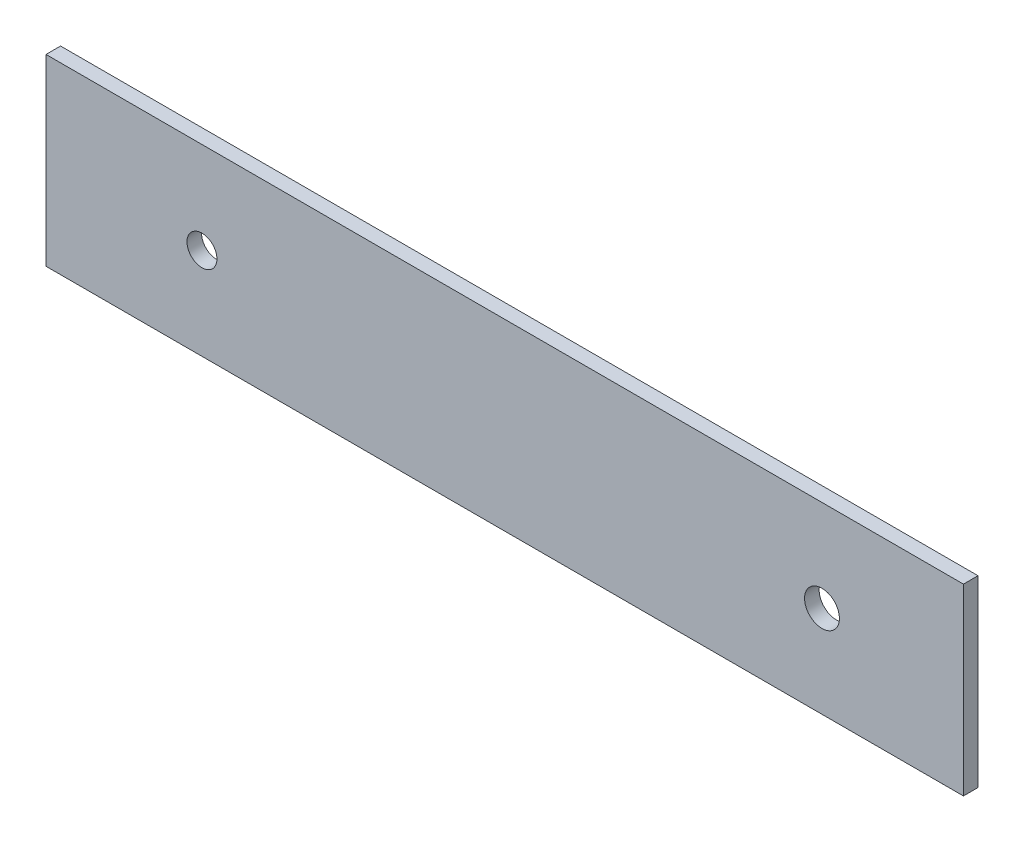
ISO-10303-21;
HEADER;
FILE_DESCRIPTION(('STEP AP214'),'2;1');
FILE_NAME('part.step','',(''),(''),'','','');
FILE_SCHEMA(('AUTOMOTIVE_DESIGN { 1 0 10303 214 1 1 1 1 }'));
ENDSEC;
DATA;
#1=APPLICATION_CONTEXT('core data for automotive mechanical design processes');
#2=APPLICATION_PROTOCOL_DEFINITION('international standard','automotive_design',2000,#1);
#3=PRODUCT_CONTEXT('',#1,'mechanical');
#4=PRODUCT('Part','Part','',(#3));
#5=PRODUCT_RELATED_PRODUCT_CATEGORY('part','',(#4));
#6=PRODUCT_DEFINITION_FORMATION('','',#4);
#7=PRODUCT_DEFINITION_CONTEXT('part definition',#1,'design');
#8=PRODUCT_DEFINITION('design','',#6,#7);
#9=PRODUCT_DEFINITION_SHAPE('','',#8);
#10=(LENGTH_UNIT() NAMED_UNIT(*) SI_UNIT(.MILLI.,.METRE.));
#11=(NAMED_UNIT(*) PLANE_ANGLE_UNIT() SI_UNIT($,.RADIAN.));
#12=(NAMED_UNIT(*) SI_UNIT($,.STERADIAN.) SOLID_ANGLE_UNIT());
#13=UNCERTAINTY_MEASURE_WITH_UNIT(LENGTH_MEASURE(1.E-05),#10,'distance_accuracy_value','');
#14=(GEOMETRIC_REPRESENTATION_CONTEXT(3) GLOBAL_UNCERTAINTY_ASSIGNED_CONTEXT((#13)) GLOBAL_UNIT_ASSIGNED_CONTEXT((#10,
#11,#12)) REPRESENTATION_CONTEXT('',''));
#15=CARTESIAN_POINT('',(0.,0.,0.));
#16=DIRECTION('',(0.,0.,1.));
#17=DIRECTION('',(1.,0.,0.));
#18=AXIS2_PLACEMENT_3D('',#15,#16,#17);
#19=CARTESIAN_POINT('',(-50.,0.,1.5875));
#20=DIRECTION('',(1.,0.,0.));
#21=DIRECTION('',(0.,0.,-1.));
#22=AXIS2_PLACEMENT_3D('',#19,#20,#21);
#23=PLANE('',#22);
#24=DIRECTION('',(0.,-1.,0.));
#25=VECTOR('',#24,1.);
#26=CARTESIAN_POINT('',(-50.,0.,0.));
#27=LINE('',#26,#25);
#28=CARTESIAN_POINT('',(-50.,20.,0.));
#29=VERTEX_POINT('',#28);
#30=CARTESIAN_POINT('',(-50.,0.,0.));
#31=VERTEX_POINT('',#30);
#32=EDGE_CURVE('E97',#29,#31,#27,.T.);
#33=ORIENTED_EDGE('',*,*,#32,.T.);
#34=DIRECTION('',(0.,0.,-1.));
#35=VECTOR('',#34,1.);
#36=CARTESIAN_POINT('',(-50.,0.,1.5875));
#37=LINE('',#36,#35);
#38=CARTESIAN_POINT('',(-50.,0.,1.5875));
#39=VERTEX_POINT('',#38);
#40=EDGE_CURVE('E11',#39,#31,#37,.T.);
#41=ORIENTED_EDGE('',*,*,#40,.F.);
#42=DIRECTION('',(0.,-1.,0.));
#43=VECTOR('',#42,1.);
#44=CARTESIAN_POINT('',(-50.,0.,1.5875));
#45=LINE('',#44,#43);
#46=CARTESIAN_POINT('',(-50.,20.,1.5875));
#47=VERTEX_POINT('',#46);
#48=EDGE_CURVE('E85',#47,#39,#45,.T.);
#49=ORIENTED_EDGE('',*,*,#48,.F.);
#50=DIRECTION('',(0.,0.,-1.));
#51=VECTOR('',#50,1.);
#52=CARTESIAN_POINT('',(-50.,20.,1.5875));
#53=LINE('',#52,#51);
#54=EDGE_CURVE('E93',#47,#29,#53,.T.);
#55=ORIENTED_EDGE('',*,*,#54,.T.);
#56=EDGE_LOOP('',(#33,#41,#49,#55));
#57=FACE_BOUND('',#56,.T.);
#58=ADVANCED_FACE('F34',(#57),#23,.F.);
#59=CARTESIAN_POINT('',(-50.,0.,1.5875));
#60=DIRECTION('',(0.,1.,0.));
#61=DIRECTION('',(0.,0.,1.));
#62=AXIS2_PLACEMENT_3D('',#59,#60,#61);
#63=PLANE('',#62);
#64=DIRECTION('',(1.,0.,0.));
#65=VECTOR('',#64,1.);
#66=CARTESIAN_POINT('',(-50.,0.,0.));
#67=LINE('',#66,#65);
#68=CARTESIAN_POINT('',(50.,0.,0.));
#69=VERTEX_POINT('',#68);
#70=EDGE_CURVE('E89',#31,#69,#67,.T.);
#71=ORIENTED_EDGE('',*,*,#70,.T.);
#72=DIRECTION('',(0.,0.,-1.));
#73=VECTOR('',#72,1.);
#74=CARTESIAN_POINT('',(50.,0.,1.5875));
#75=LINE('',#74,#73);
#76=CARTESIAN_POINT('',(50.,0.,1.5875));
#77=VERTEX_POINT('',#76);
#78=EDGE_CURVE('E42',#77,#69,#75,.T.);
#79=ORIENTED_EDGE('',*,*,#78,.F.);
#80=DIRECTION('',(1.,0.,0.));
#81=VECTOR('',#80,1.);
#82=CARTESIAN_POINT('',(-50.,0.,1.5875));
#83=LINE('',#82,#81);
#84=EDGE_CURVE('E80',#39,#77,#83,.T.);
#85=ORIENTED_EDGE('',*,*,#84,.F.);
#86=ORIENTED_EDGE('',*,*,#40,.T.);
#87=EDGE_LOOP('',(#71,#79,#85,#86));
#88=FACE_BOUND('',#87,.T.);
#89=ADVANCED_FACE('F88',(#88),#63,.F.);
#90=CARTESIAN_POINT('',(50.,0.,1.5875));
#91=DIRECTION('',(-1.,0.,0.));
#92=DIRECTION('',(0.,0.,1.));
#93=AXIS2_PLACEMENT_3D('',#90,#91,#92);
#94=PLANE('',#93);
#95=DIRECTION('',(0.,1.,0.));
#96=VECTOR('',#95,1.);
#97=CARTESIAN_POINT('',(50.,0.,0.));
#98=LINE('',#97,#96);
#99=CARTESIAN_POINT('',(50.,20.,0.));
#100=VERTEX_POINT('',#99);
#101=EDGE_CURVE('E67',#69,#100,#98,.T.);
#102=ORIENTED_EDGE('',*,*,#101,.T.);
#103=DIRECTION('',(0.,0.,-1.));
#104=VECTOR('',#103,1.);
#105=CARTESIAN_POINT('',(50.,20.,1.5875));
#106=LINE('',#105,#104);
#107=CARTESIAN_POINT('',(50.,20.,1.5875));
#108=VERTEX_POINT('',#107);
#109=EDGE_CURVE('E90',#108,#100,#106,.T.);
#110=ORIENTED_EDGE('',*,*,#109,.F.);
#111=DIRECTION('',(0.,1.,0.));
#112=VECTOR('',#111,1.);
#113=CARTESIAN_POINT('',(50.,0.,1.5875));
#114=LINE('',#113,#112);
#115=EDGE_CURVE('E83',#77,#108,#114,.T.);
#116=ORIENTED_EDGE('',*,*,#115,.F.);
#117=ORIENTED_EDGE('',*,*,#78,.T.);
#118=EDGE_LOOP('',(#102,#110,#116,#117));
#119=FACE_BOUND('',#118,.T.);
#120=ADVANCED_FACE('F91',(#119),#94,.F.);
#121=CARTESIAN_POINT('',(-50.,20.,1.5875));
#122=DIRECTION('',(0.,-1.,0.));
#123=DIRECTION('',(0.,0.,-1.));
#124=AXIS2_PLACEMENT_3D('',#121,#122,#123);
#125=PLANE('',#124);
#126=DIRECTION('',(-1.,0.,0.));
#127=VECTOR('',#126,1.);
#128=CARTESIAN_POINT('',(-50.,20.,0.));
#129=LINE('',#128,#127);
#130=EDGE_CURVE('E73',#100,#29,#129,.T.);
#131=ORIENTED_EDGE('',*,*,#130,.T.);
#132=ORIENTED_EDGE('',*,*,#54,.F.);
#133=DIRECTION('',(-1.,0.,0.));
#134=VECTOR('',#133,1.);
#135=CARTESIAN_POINT('',(-50.,20.,1.5875));
#136=LINE('',#135,#134);
#137=EDGE_CURVE('E50',#108,#47,#136,.T.);
#138=ORIENTED_EDGE('',*,*,#137,.F.);
#139=ORIENTED_EDGE('',*,*,#109,.T.);
#140=EDGE_LOOP('',(#131,#132,#138,#139));
#141=FACE_BOUND('',#140,.T.);
#142=ADVANCED_FACE('F105',(#141),#125,.F.);
#143=CARTESIAN_POINT('',(0.,0.,1.5875));
#144=DIRECTION('',(0.,0.,-1.));
#145=DIRECTION('',(-1.,0.,0.));
#146=AXIS2_PLACEMENT_3D('',#143,#144,#145);
#147=PLANE('',#146);
#148=CARTESIAN_POINT('',(34.58,10.,1.5875));
#149=DIRECTION('',(0.,0.,1.));
#150=DIRECTION('',(1.,0.,0.));
#151=AXIS2_PLACEMENT_3D('',#148,#149,#150);
#152=CIRCLE('',#151,1.89865);
#153=CARTESIAN_POINT('',(36.47865,10.,1.5875));
#154=VERTEX_POINT('',#153);
#155=EDGE_CURVE('E119',#154,#154,#152,.T.);
#156=ORIENTED_EDGE('',*,*,#155,.F.);
#157=EDGE_LOOP('',(#156));
#158=FACE_BOUND('',#157,.T.);
#159=CARTESIAN_POINT('',(-33.,10.,1.5875));
#160=DIRECTION('',(0.,0.,1.));
#161=DIRECTION('',(1.,0.,0.));
#162=AXIS2_PLACEMENT_3D('',#159,#160,#161);
#163=CIRCLE('',#162,1.63195);
#164=CARTESIAN_POINT('',(-31.36805,10.,1.5875));
#165=VERTEX_POINT('',#164);
#166=EDGE_CURVE('E113',#165,#165,#163,.T.);
#167=ORIENTED_EDGE('',*,*,#166,.F.);
#168=EDGE_LOOP('',(#167));
#169=FACE_BOUND('',#168,.T.);
#170=ORIENTED_EDGE('',*,*,#48,.T.);
#171=ORIENTED_EDGE('',*,*,#84,.T.);
#172=ORIENTED_EDGE('',*,*,#115,.T.);
#173=ORIENTED_EDGE('',*,*,#137,.T.);
#174=EDGE_LOOP('',(#170,#171,#172,#173));
#175=FACE_BOUND('',#174,.T.);
#176=ADVANCED_FACE('F81',(#158,#169,#175),#147,.F.);
#177=CARTESIAN_POINT('',(0.,0.,0.));
#178=DIRECTION('',(0.,0.,-1.));
#179=DIRECTION('',(-1.,0.,0.));
#180=AXIS2_PLACEMENT_3D('',#177,#178,#179);
#181=PLANE('',#180);
#182=CARTESIAN_POINT('',(34.58,10.,0.));
#183=DIRECTION('',(0.,0.,1.));
#184=DIRECTION('',(1.,0.,0.));
#185=AXIS2_PLACEMENT_3D('',#182,#183,#184);
#186=CIRCLE('',#185,1.89865);
#187=CARTESIAN_POINT('',(36.47865,10.,0.));
#188=VERTEX_POINT('',#187);
#189=EDGE_CURVE('E116',#188,#188,#186,.T.);
#190=ORIENTED_EDGE('',*,*,#189,.T.);
#191=EDGE_LOOP('',(#190));
#192=FACE_BOUND('',#191,.T.);
#193=CARTESIAN_POINT('',(-33.,10.,0.));
#194=DIRECTION('',(0.,0.,1.));
#195=DIRECTION('',(1.,0.,0.));
#196=AXIS2_PLACEMENT_3D('',#193,#194,#195);
#197=CIRCLE('',#196,1.63195);
#198=CARTESIAN_POINT('',(-31.36805,10.,0.));
#199=VERTEX_POINT('',#198);
#200=EDGE_CURVE('E100',#199,#199,#197,.T.);
#201=ORIENTED_EDGE('',*,*,#200,.T.);
#202=EDGE_LOOP('',(#201));
#203=FACE_BOUND('',#202,.T.);
#204=ORIENTED_EDGE('',*,*,#32,.F.);
#205=ORIENTED_EDGE('',*,*,#130,.F.);
#206=ORIENTED_EDGE('',*,*,#101,.F.);
#207=ORIENTED_EDGE('',*,*,#70,.F.);
#208=EDGE_LOOP('',(#204,#205,#206,#207));
#209=FACE_BOUND('',#208,.T.);
#210=ADVANCED_FACE('F108',(#192,#203,#209),#181,.T.);
#211=CARTESIAN_POINT('',(-33.,10.,1.5875));
#212=DIRECTION('',(0.,0.,1.));
#213=DIRECTION('',(1.,0.,0.));
#214=AXIS2_PLACEMENT_3D('',#211,#212,#213);
#215=CYLINDRICAL_SURFACE('',#214,1.63195);
#216=ORIENTED_EDGE('',*,*,#200,.F.);
#217=EDGE_LOOP('',(#216));
#218=FACE_BOUND('',#217,.T.);
#219=ORIENTED_EDGE('',*,*,#166,.T.);
#220=EDGE_LOOP('',(#219));
#221=FACE_BOUND('',#220,.T.);
#222=ADVANCED_FACE('F130',(#218,#221),#215,.F.);
#223=CARTESIAN_POINT('',(34.58,10.,1.5875));
#224=DIRECTION('',(0.,0.,1.));
#225=DIRECTION('',(1.,0.,0.));
#226=AXIS2_PLACEMENT_3D('',#223,#224,#225);
#227=CYLINDRICAL_SURFACE('',#226,1.89865);
#228=ORIENTED_EDGE('',*,*,#189,.F.);
#229=EDGE_LOOP('',(#228));
#230=FACE_BOUND('',#229,.T.);
#231=ORIENTED_EDGE('',*,*,#155,.T.);
#232=EDGE_LOOP('',(#231));
#233=FACE_BOUND('',#232,.T.);
#234=ADVANCED_FACE('F123',(#230,#233),#227,.F.);
#235=CLOSED_SHELL('',(#58,#89,#120,#142,#176,#210,#222,#234));
#236=MANIFOLD_SOLID_BREP('B2',#235);
#237=ADVANCED_BREP_SHAPE_REPRESENTATION('',(#18,#236),#14);
#238=SHAPE_DEFINITION_REPRESENTATION(#9,#237);
ENDSEC;
END-ISO-10303-21;
